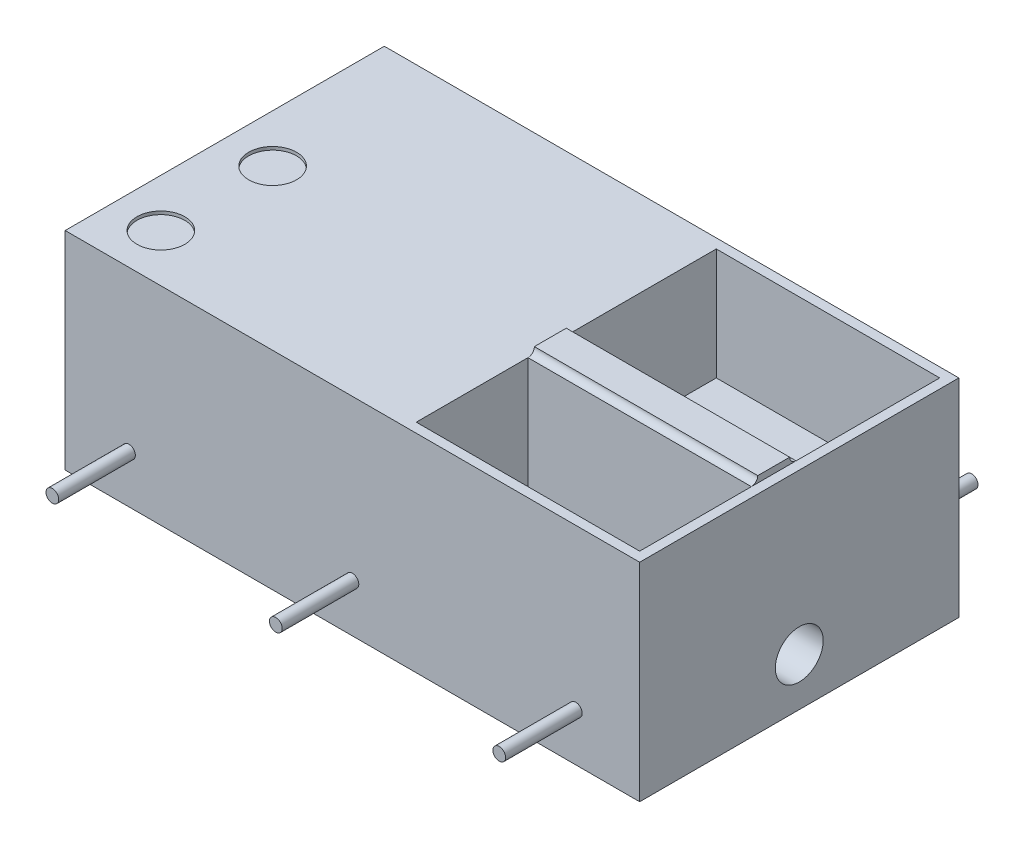
ISO-10303-21;
HEADER;
FILE_DESCRIPTION(('STEP AP214'),'2;1');
FILE_NAME('part.step','',(''),(''),'','','');
FILE_SCHEMA(('AUTOMOTIVE_DESIGN { 1 0 10303 214 1 1 1 1 }'));
ENDSEC;
DATA;
#1=APPLICATION_CONTEXT('core data for automotive mechanical design processes');
#2=APPLICATION_PROTOCOL_DEFINITION('international standard','automotive_design',2000,#1);
#3=PRODUCT_CONTEXT('',#1,'mechanical');
#4=PRODUCT('Part','Part','',(#3));
#5=PRODUCT_RELATED_PRODUCT_CATEGORY('part','',(#4));
#6=PRODUCT_DEFINITION_FORMATION('','',#4);
#7=PRODUCT_DEFINITION_CONTEXT('part definition',#1,'design');
#8=PRODUCT_DEFINITION('design','',#6,#7);
#9=PRODUCT_DEFINITION_SHAPE('','',#8);
#10=(LENGTH_UNIT() NAMED_UNIT(*) SI_UNIT(.MILLI.,.METRE.));
#11=(NAMED_UNIT(*) PLANE_ANGLE_UNIT() SI_UNIT($,.RADIAN.));
#12=(NAMED_UNIT(*) SI_UNIT($,.STERADIAN.) SOLID_ANGLE_UNIT());
#13=UNCERTAINTY_MEASURE_WITH_UNIT(LENGTH_MEASURE(1.E-05),#10,'distance_accuracy_value','');
#14=(GEOMETRIC_REPRESENTATION_CONTEXT(3) GLOBAL_UNCERTAINTY_ASSIGNED_CONTEXT((#13)) GLOBAL_UNIT_ASSIGNED_CONTEXT((#10,
#11,#12)) REPRESENTATION_CONTEXT('',''));
#15=CARTESIAN_POINT('',(0.,0.,0.));
#16=DIRECTION('',(0.,0.,1.));
#17=DIRECTION('',(1.,0.,0.));
#18=AXIS2_PLACEMENT_3D('',#15,#16,#17);
#19=CARTESIAN_POINT('',(900.,-650.,-500.));
#20=DIRECTION('',(1.,0.,0.));
#21=DIRECTION('',(0.,0.,-1.));
#22=AXIS2_PLACEMENT_3D('',#19,#20,#21);
#23=PLANE('',#22);
#24=CARTESIAN_POINT('',(900.,-500.,0.));
#25=DIRECTION('',(1.,0.,0.));
#26=DIRECTION('',(0.,0.,-1.));
#27=AXIS2_PLACEMENT_3D('',#24,#25,#26);
#28=CIRCLE('',#27,75.);
#29=CARTESIAN_POINT('',(900.,-500.,-75.));
#30=VERTEX_POINT('',#29);
#31=EDGE_CURVE('E397',#30,#30,#28,.T.);
#32=ORIENTED_EDGE('',*,*,#31,.F.);
#33=EDGE_LOOP('',(#32));
#34=FACE_BOUND('',#33,.T.);
#35=DIRECTION('',(0.,0.,-1.));
#36=VECTOR('',#35,1.);
#37=CARTESIAN_POINT('',(900.,0.,-500.));
#38=LINE('',#37,#36);
#39=CARTESIAN_POINT('',(900.,0.,500.));
#40=VERTEX_POINT('',#39);
#41=CARTESIAN_POINT('',(900.,0.,-500.));
#42=VERTEX_POINT('',#41);
#43=EDGE_CURVE('E283',#40,#42,#38,.T.);
#44=ORIENTED_EDGE('',*,*,#43,.F.);
#45=DIRECTION('',(0.,1.,0.));
#46=VECTOR('',#45,1.);
#47=CARTESIAN_POINT('',(900.,-650.,500.));
#48=LINE('',#47,#46);
#49=CARTESIAN_POINT('',(900.,-650.,500.));
#50=VERTEX_POINT('',#49);
#51=EDGE_CURVE('E321',#50,#40,#48,.T.);
#52=ORIENTED_EDGE('',*,*,#51,.F.);
#53=DIRECTION('',(0.,0.,-1.));
#54=VECTOR('',#53,1.);
#55=CARTESIAN_POINT('',(900.,-650.,-500.));
#56=LINE('',#55,#54);
#57=CARTESIAN_POINT('',(900.,-650.,-500.));
#58=VERTEX_POINT('',#57);
#59=EDGE_CURVE('E289',#50,#58,#56,.T.);
#60=ORIENTED_EDGE('',*,*,#59,.T.);
#61=DIRECTION('',(0.,1.,0.));
#62=VECTOR('',#61,1.);
#63=CARTESIAN_POINT('',(900.,-650.,-500.));
#64=LINE('',#63,#62);
#65=EDGE_CURVE('E306',#58,#42,#64,.T.);
#66=ORIENTED_EDGE('',*,*,#65,.T.);
#67=EDGE_LOOP('',(#44,#52,#60,#66));
#68=FACE_BOUND('',#67,.T.);
#69=ADVANCED_FACE('F38',(#34,#68),#23,.T.);
#70=CARTESIAN_POINT('',(-900.,-650.,500.));
#71=DIRECTION('',(0.,0.,1.));
#72=DIRECTION('',(1.,0.,0.));
#73=AXIS2_PLACEMENT_3D('',#70,#71,#72);
#74=PLANE('',#73);
#75=CARTESIAN_POINT('',(700.,-500.,500.));
#76=DIRECTION('',(0.,0.,1.));
#77=DIRECTION('',(1.,0.,0.));
#78=AXIS2_PLACEMENT_3D('',#75,#76,#77);
#79=CIRCLE('',#78,20.);
#80=CARTESIAN_POINT('',(720.,-500.,500.));
#81=VERTEX_POINT('',#80);
#82=EDGE_CURVE('E258',#81,#81,#79,.T.);
#83=ORIENTED_EDGE('',*,*,#82,.F.);
#84=EDGE_LOOP('',(#83));
#85=FACE_BOUND('',#84,.T.);
#86=CARTESIAN_POINT('',(-700.,-500.,500.));
#87=DIRECTION('',(0.,0.,1.));
#88=DIRECTION('',(1.,0.,0.));
#89=AXIS2_PLACEMENT_3D('',#86,#87,#88);
#90=CIRCLE('',#89,20.);
#91=CARTESIAN_POINT('',(-680.,-500.,500.));
#92=VERTEX_POINT('',#91);
#93=EDGE_CURVE('E271',#92,#92,#90,.T.);
#94=ORIENTED_EDGE('',*,*,#93,.F.);
#95=EDGE_LOOP('',(#94));
#96=FACE_BOUND('',#95,.T.);
#97=CARTESIAN_POINT('',(-1.11022302462516E-13,-500.,500.));
#98=DIRECTION('',(0.,0.,1.));
#99=DIRECTION('',(1.,0.,0.));
#100=AXIS2_PLACEMENT_3D('',#97,#98,#99);
#101=CIRCLE('',#100,20.);
#102=CARTESIAN_POINT('',(19.9999999999999,-500.,500.));
#103=VERTEX_POINT('',#102);
#104=EDGE_CURVE('E284',#103,#103,#101,.T.);
#105=ORIENTED_EDGE('',*,*,#104,.F.);
#106=EDGE_LOOP('',(#105));
#107=FACE_BOUND('',#106,.T.);
#108=DIRECTION('',(1.,0.,0.));
#109=VECTOR('',#108,1.);
#110=CARTESIAN_POINT('',(-900.,0.,500.));
#111=LINE('',#110,#109);
#112=CARTESIAN_POINT('',(-900.,0.,500.));
#113=VERTEX_POINT('',#112);
#114=EDGE_CURVE('E294',#113,#40,#111,.T.);
#115=ORIENTED_EDGE('',*,*,#114,.F.);
#116=DIRECTION('',(0.,1.,0.));
#117=VECTOR('',#116,1.);
#118=CARTESIAN_POINT('',(-900.,-650.,500.));
#119=LINE('',#118,#117);
#120=CARTESIAN_POINT('',(-900.,-650.,500.));
#121=VERTEX_POINT('',#120);
#122=EDGE_CURVE('E324',#121,#113,#119,.T.);
#123=ORIENTED_EDGE('',*,*,#122,.F.);
#124=DIRECTION('',(1.,0.,0.));
#125=VECTOR('',#124,1.);
#126=CARTESIAN_POINT('',(-900.,-650.,500.));
#127=LINE('',#126,#125);
#128=EDGE_CURVE('E302',#121,#50,#127,.T.);
#129=ORIENTED_EDGE('',*,*,#128,.T.);
#130=ORIENTED_EDGE('',*,*,#51,.T.);
#131=EDGE_LOOP('',(#115,#123,#129,#130));
#132=FACE_BOUND('',#131,.T.);
#133=ADVANCED_FACE('F386',(#85,#96,#107,#132),#74,.T.);
#134=CARTESIAN_POINT('',(-900.,-650.,-500.));
#135=DIRECTION('',(-1.,0.,0.));
#136=DIRECTION('',(0.,0.,1.));
#137=AXIS2_PLACEMENT_3D('',#134,#135,#136);
#138=PLANE('',#137);
#139=CARTESIAN_POINT('',(-900.,-500.,4.2188474935756E-13));
#140=DIRECTION('',(-1.,0.,0.));
#141=DIRECTION('',(0.,0.,1.));
#142=AXIS2_PLACEMENT_3D('',#139,#140,#141);
#143=CIRCLE('',#142,75.);
#144=CARTESIAN_POINT('',(-900.,-500.,75.0000000000004));
#145=VERTEX_POINT('',#144);
#146=EDGE_CURVE('E349',#145,#145,#143,.F.);
#147=ORIENTED_EDGE('',*,*,#146,.T.);
#148=EDGE_LOOP('',(#147));
#149=FACE_BOUND('',#148,.T.);
#150=DIRECTION('',(0.,0.,1.));
#151=VECTOR('',#150,1.);
#152=CARTESIAN_POINT('',(-900.,0.,-500.));
#153=LINE('',#152,#151);
#154=CARTESIAN_POINT('',(-900.,0.,-500.));
#155=VERTEX_POINT('',#154);
#156=EDGE_CURVE('E314',#155,#113,#153,.T.);
#157=ORIENTED_EDGE('',*,*,#156,.F.);
#158=DIRECTION('',(0.,1.,0.));
#159=VECTOR('',#158,1.);
#160=CARTESIAN_POINT('',(-900.,-650.,-500.));
#161=LINE('',#160,#159);
#162=CARTESIAN_POINT('',(-900.,-650.,-500.));
#163=VERTEX_POINT('',#162);
#164=EDGE_CURVE('E327',#163,#155,#161,.T.);
#165=ORIENTED_EDGE('',*,*,#164,.F.);
#166=DIRECTION('',(0.,0.,1.));
#167=VECTOR('',#166,1.);
#168=CARTESIAN_POINT('',(-900.,-650.,-500.));
#169=LINE('',#168,#167);
#170=EDGE_CURVE('E298',#163,#121,#169,.T.);
#171=ORIENTED_EDGE('',*,*,#170,.T.);
#172=ORIENTED_EDGE('',*,*,#122,.T.);
#173=EDGE_LOOP('',(#157,#165,#171,#172));
#174=FACE_BOUND('',#173,.T.);
#175=ADVANCED_FACE('F391',(#149,#174),#138,.T.);
#176=CARTESIAN_POINT('',(-900.,-650.,-500.));
#177=DIRECTION('',(0.,0.,-1.));
#178=DIRECTION('',(-1.,0.,0.));
#179=AXIS2_PLACEMENT_3D('',#176,#177,#178);
#180=PLANE('',#179);
#181=CARTESIAN_POINT('',(700.,-500.,-500.));
#182=DIRECTION('',(0.,0.,-1.));
#183=DIRECTION('',(-1.,0.,0.));
#184=AXIS2_PLACEMENT_3D('',#181,#182,#183);
#185=CIRCLE('',#184,20.);
#186=CARTESIAN_POINT('',(680.,-500.,-500.));
#187=VERTEX_POINT('',#186);
#188=EDGE_CURVE('E262',#187,#187,#185,.T.);
#189=ORIENTED_EDGE('',*,*,#188,.F.);
#190=EDGE_LOOP('',(#189));
#191=FACE_BOUND('',#190,.T.);
#192=CARTESIAN_POINT('',(-700.,-500.,-500.));
#193=DIRECTION('',(0.,0.,-1.));
#194=DIRECTION('',(-1.,0.,0.));
#195=AXIS2_PLACEMENT_3D('',#192,#193,#194);
#196=CIRCLE('',#195,20.);
#197=CARTESIAN_POINT('',(-720.,-500.,-500.));
#198=VERTEX_POINT('',#197);
#199=EDGE_CURVE('E275',#198,#198,#196,.T.);
#200=ORIENTED_EDGE('',*,*,#199,.F.);
#201=EDGE_LOOP('',(#200));
#202=FACE_BOUND('',#201,.T.);
#203=CARTESIAN_POINT('',(-1.11022302462516E-13,-500.,-500.));
#204=DIRECTION('',(0.,0.,-1.));
#205=DIRECTION('',(-1.,0.,0.));
#206=AXIS2_PLACEMENT_3D('',#203,#204,#205);
#207=CIRCLE('',#206,20.);
#208=CARTESIAN_POINT('',(-20.0000000000001,-500.,-500.));
#209=VERTEX_POINT('',#208);
#210=EDGE_CURVE('E288',#209,#209,#207,.T.);
#211=ORIENTED_EDGE('',*,*,#210,.F.);
#212=EDGE_LOOP('',(#211));
#213=FACE_BOUND('',#212,.T.);
#214=DIRECTION('',(-1.,0.,0.));
#215=VECTOR('',#214,1.);
#216=CARTESIAN_POINT('',(-900.,0.,-500.));
#217=LINE('',#216,#215);
#218=EDGE_CURVE('E310',#42,#155,#217,.T.);
#219=ORIENTED_EDGE('',*,*,#218,.F.);
#220=ORIENTED_EDGE('',*,*,#65,.F.);
#221=DIRECTION('',(-1.,0.,0.));
#222=VECTOR('',#221,1.);
#223=CARTESIAN_POINT('',(-900.,-650.,-500.));
#224=LINE('',#223,#222);
#225=EDGE_CURVE('E293',#58,#163,#224,.T.);
#226=ORIENTED_EDGE('',*,*,#225,.T.);
#227=ORIENTED_EDGE('',*,*,#164,.T.);
#228=EDGE_LOOP('',(#219,#220,#226,#227));
#229=FACE_BOUND('',#228,.T.);
#230=ADVANCED_FACE('F410',(#191,#202,#213,#229),#180,.T.);
#231=CARTESIAN_POINT('',(0.,-650.,0.));
#232=DIRECTION('',(0.,1.,0.));
#233=DIRECTION('',(0.,0.,1.));
#234=AXIS2_PLACEMENT_3D('',#231,#232,#233);
#235=PLANE('',#234);
#236=ORIENTED_EDGE('',*,*,#59,.F.);
#237=ORIENTED_EDGE('',*,*,#128,.F.);
#238=ORIENTED_EDGE('',*,*,#170,.F.);
#239=ORIENTED_EDGE('',*,*,#225,.F.);
#240=EDGE_LOOP('',(#236,#237,#238,#239));
#241=FACE_BOUND('',#240,.T.);
#242=ADVANCED_FACE('F407',(#241),#235,.F.);
#243=CARTESIAN_POINT('',(0.,0.,0.));
#244=DIRECTION('',(0.,1.,0.));
#245=DIRECTION('',(0.,0.,1.));
#246=AXIS2_PLACEMENT_3D('',#243,#244,#245);
#247=PLANE('',#246);
#248=CARTESIAN_POINT('',(-750.,0.,0.));
#249=DIRECTION('',(0.,1.,0.));
#250=DIRECTION('',(0.,0.,1.));
#251=AXIS2_PLACEMENT_3D('',#248,#249,#250);
#252=CIRCLE('',#251,75.);
#253=CARTESIAN_POINT('',(-750.,0.,75.));
#254=VERTEX_POINT('',#253);
#255=EDGE_CURVE('E642',#254,#254,#252,.T.);
#256=ORIENTED_EDGE('',*,*,#255,.F.);
#257=EDGE_LOOP('',(#256));
#258=FACE_BOUND('',#257,.T.);
#259=CARTESIAN_POINT('',(-750.,0.,350.));
#260=DIRECTION('',(0.,1.,0.));
#261=DIRECTION('',(0.,0.,1.));
#262=AXIS2_PLACEMENT_3D('',#259,#260,#261);
#263=CIRCLE('',#262,75.);
#264=CARTESIAN_POINT('',(-750.,0.,425.));
#265=VERTEX_POINT('',#264);
#266=EDGE_CURVE('E641',#265,#265,#263,.T.);
#267=ORIENTED_EDGE('',*,*,#266,.F.);
#268=EDGE_LOOP('',(#267));
#269=FACE_BOUND('',#268,.T.);
#270=DIRECTION('',(0.,0.,1.));
#271=VECTOR('',#270,1.);
#272=CARTESIAN_POINT('',(170.,0.,-19.9999999999999));
#273=LINE('',#272,#271);
#274=CARTESIAN_POINT('',(170.,1.28369537222284E-13,-19.9999999999999));
#275=VERTEX_POINT('',#274);
#276=CARTESIAN_POINT('',(170.,0.,120.));
#277=VERTEX_POINT('',#276);
#278=EDGE_CURVE('E153',#275,#277,#273,.T.);
#279=ORIENTED_EDGE('',*,*,#278,.F.);
#280=DIRECTION('',(0.,0.,1.));
#281=VECTOR('',#280,1.);
#282=CARTESIAN_POINT('',(170.,0.,-470.));
#283=LINE('',#282,#281);
#284=CARTESIAN_POINT('',(170.,0.,-470.));
#285=VERTEX_POINT('',#284);
#286=EDGE_CURVE('E165',#285,#275,#283,.T.);
#287=ORIENTED_EDGE('',*,*,#286,.F.);
#288=DIRECTION('',(-1.,0.,0.));
#289=VECTOR('',#288,1.);
#290=CARTESIAN_POINT('',(870.,0.,-470.));
#291=LINE('',#290,#289);
#292=CARTESIAN_POINT('',(870.,0.,-470.));
#293=VERTEX_POINT('',#292);
#294=EDGE_CURVE('E187',#293,#285,#291,.T.);
#295=ORIENTED_EDGE('',*,*,#294,.F.);
#296=DIRECTION('',(0.,0.,-1.));
#297=VECTOR('',#296,1.);
#298=CARTESIAN_POINT('',(870.,0.,-470.));
#299=LINE('',#298,#297);
#300=CARTESIAN_POINT('',(870.,1.28369537222284E-13,-19.9999999999999));
#301=VERTEX_POINT('',#300);
#302=EDGE_CURVE('E194',#301,#293,#299,.T.);
#303=ORIENTED_EDGE('',*,*,#302,.F.);
#304=DIRECTION('',(0.,0.,-1.));
#305=VECTOR('',#304,1.);
#306=CARTESIAN_POINT('',(870.,0.,-19.9999999999999));
#307=LINE('',#306,#305);
#308=CARTESIAN_POINT('',(870.,0.,120.));
#309=VERTEX_POINT('',#308);
#310=EDGE_CURVE('E169',#309,#301,#307,.T.);
#311=ORIENTED_EDGE('',*,*,#310,.F.);
#312=DIRECTION('',(0.,0.,-1.));
#313=VECTOR('',#312,1.);
#314=CARTESIAN_POINT('',(870.,0.,120.));
#315=LINE('',#314,#313);
#316=CARTESIAN_POINT('',(870.,0.,470.));
#317=VERTEX_POINT('',#316);
#318=EDGE_CURVE('E213',#317,#309,#315,.T.);
#319=ORIENTED_EDGE('',*,*,#318,.F.);
#320=DIRECTION('',(1.,0.,0.));
#321=VECTOR('',#320,1.);
#322=CARTESIAN_POINT('',(170.,0.,470.));
#323=LINE('',#322,#321);
#324=CARTESIAN_POINT('',(170.,0.,470.));
#325=VERTEX_POINT('',#324);
#326=EDGE_CURVE('E228',#325,#317,#323,.T.);
#327=ORIENTED_EDGE('',*,*,#326,.F.);
#328=DIRECTION('',(0.,0.,1.));
#329=VECTOR('',#328,1.);
#330=CARTESIAN_POINT('',(170.,0.,120.));
#331=LINE('',#330,#329);
#332=EDGE_CURVE('E167',#277,#325,#331,.T.);
#333=ORIENTED_EDGE('',*,*,#332,.F.);
#334=EDGE_LOOP('',(#279,#287,#295,#303,#311,#319,#327,#333));
#335=FACE_BOUND('',#334,.T.);
#336=ORIENTED_EDGE('',*,*,#43,.T.);
#337=ORIENTED_EDGE('',*,*,#218,.T.);
#338=ORIENTED_EDGE('',*,*,#156,.T.);
#339=ORIENTED_EDGE('',*,*,#114,.T.);
#340=EDGE_LOOP('',(#336,#337,#338,#339));
#341=FACE_BOUND('',#340,.T.);
#342=ADVANCED_FACE('F161',(#258,#269,#335,#341),#247,.T.);
#343=CARTESIAN_POINT('',(-1.11022302462516E-13,-500.,-740.));
#344=DIRECTION('',(0.,0.,1.));
#345=DIRECTION('',(1.,0.,0.));
#346=AXIS2_PLACEMENT_3D('',#343,#344,#345);
#347=PLANE('',#346);
#348=CARTESIAN_POINT('',(-1.11022302462516E-13,-500.,-740.));
#349=DIRECTION('',(0.,0.,1.));
#350=DIRECTION('',(1.,0.,0.));
#351=AXIS2_PLACEMENT_3D('',#348,#349,#350);
#352=CIRCLE('',#351,20.);
#353=CARTESIAN_POINT('',(19.9999999999999,-500.,-740.));
#354=VERTEX_POINT('',#353);
#355=EDGE_CURVE('E279',#354,#354,#352,.T.);
#356=ORIENTED_EDGE('',*,*,#355,.F.);
#357=EDGE_LOOP('',(#356));
#358=FACE_BOUND('',#357,.T.);
#359=ADVANCED_FACE('F423',(#358),#347,.F.);
#360=CARTESIAN_POINT('',(-1.11022302462516E-13,-500.,-740.));
#361=DIRECTION('',(0.,0.,1.));
#362=DIRECTION('',(1.,0.,0.));
#363=AXIS2_PLACEMENT_3D('',#360,#361,#362);
#364=CYLINDRICAL_SURFACE('',#363,20.);
#365=ORIENTED_EDGE('',*,*,#210,.T.);
#366=EDGE_LOOP('',(#365));
#367=FACE_BOUND('',#366,.T.);
#368=ORIENTED_EDGE('',*,*,#355,.T.);
#369=EDGE_LOOP('',(#368));
#370=FACE_BOUND('',#369,.T.);
#371=ADVANCED_FACE('F427',(#367,#370),#364,.T.);
#372=ORIENTED_EDGE('',*,*,#104,.T.);
#373=EDGE_LOOP('',(#372));
#374=FACE_BOUND('',#373,.T.);
#375=CARTESIAN_POINT('',(-1.11022302462516E-13,-500.,740.));
#376=DIRECTION('',(0.,0.,1.));
#377=DIRECTION('',(1.,0.,0.));
#378=AXIS2_PLACEMENT_3D('',#375,#376,#377);
#379=CIRCLE('',#378,20.);
#380=CARTESIAN_POINT('',(19.9999999999999,-500.,740.));
#381=VERTEX_POINT('',#380);
#382=EDGE_CURVE('E270',#381,#381,#379,.T.);
#383=ORIENTED_EDGE('',*,*,#382,.F.);
#384=EDGE_LOOP('',(#383));
#385=FACE_BOUND('',#384,.T.);
#386=ADVANCED_FACE('F430',(#374,#385),#364,.T.);
#387=CARTESIAN_POINT('',(-1.11022302462516E-13,-500.,740.));
#388=DIRECTION('',(0.,0.,1.));
#389=DIRECTION('',(1.,0.,0.));
#390=AXIS2_PLACEMENT_3D('',#387,#388,#389);
#391=PLANE('',#390);
#392=ORIENTED_EDGE('',*,*,#382,.T.);
#393=EDGE_LOOP('',(#392));
#394=FACE_BOUND('',#393,.T.);
#395=ADVANCED_FACE('F435',(#394),#391,.T.);
#396=CARTESIAN_POINT('',(-700.,-500.,-740.));
#397=DIRECTION('',(0.,0.,1.));
#398=DIRECTION('',(1.,0.,0.));
#399=AXIS2_PLACEMENT_3D('',#396,#397,#398);
#400=PLANE('',#399);
#401=CARTESIAN_POINT('',(-700.,-500.,-740.));
#402=DIRECTION('',(0.,0.,1.));
#403=DIRECTION('',(1.,0.,0.));
#404=AXIS2_PLACEMENT_3D('',#401,#402,#403);
#405=CIRCLE('',#404,20.);
#406=CARTESIAN_POINT('',(-680.,-500.,-740.));
#407=VERTEX_POINT('',#406);
#408=EDGE_CURVE('E266',#407,#407,#405,.T.);
#409=ORIENTED_EDGE('',*,*,#408,.F.);
#410=EDGE_LOOP('',(#409));
#411=FACE_BOUND('',#410,.T.);
#412=ADVANCED_FACE('F438',(#411),#400,.F.);
#413=CARTESIAN_POINT('',(-700.,-500.,-740.));
#414=DIRECTION('',(0.,0.,1.));
#415=DIRECTION('',(1.,0.,0.));
#416=AXIS2_PLACEMENT_3D('',#413,#414,#415);
#417=CYLINDRICAL_SURFACE('',#416,20.);
#418=ORIENTED_EDGE('',*,*,#199,.T.);
#419=EDGE_LOOP('',(#418));
#420=FACE_BOUND('',#419,.T.);
#421=ORIENTED_EDGE('',*,*,#408,.T.);
#422=EDGE_LOOP('',(#421));
#423=FACE_BOUND('',#422,.T.);
#424=ADVANCED_FACE('F440',(#420,#423),#417,.T.);
#425=ORIENTED_EDGE('',*,*,#93,.T.);
#426=EDGE_LOOP('',(#425));
#427=FACE_BOUND('',#426,.T.);
#428=CARTESIAN_POINT('',(-700.,-500.,740.));
#429=DIRECTION('',(0.,0.,1.));
#430=DIRECTION('',(1.,0.,0.));
#431=AXIS2_PLACEMENT_3D('',#428,#429,#430);
#432=CIRCLE('',#431,20.);
#433=CARTESIAN_POINT('',(-680.,-500.,740.));
#434=VERTEX_POINT('',#433);
#435=EDGE_CURVE('E257',#434,#434,#432,.T.);
#436=ORIENTED_EDGE('',*,*,#435,.F.);
#437=EDGE_LOOP('',(#436));
#438=FACE_BOUND('',#437,.T.);
#439=ADVANCED_FACE('F443',(#427,#438),#417,.T.);
#440=CARTESIAN_POINT('',(-700.,-500.,740.));
#441=DIRECTION('',(0.,0.,1.));
#442=DIRECTION('',(1.,0.,0.));
#443=AXIS2_PLACEMENT_3D('',#440,#441,#442);
#444=PLANE('',#443);
#445=ORIENTED_EDGE('',*,*,#435,.T.);
#446=EDGE_LOOP('',(#445));
#447=FACE_BOUND('',#446,.T.);
#448=ADVANCED_FACE('F448',(#447),#444,.T.);
#449=CARTESIAN_POINT('',(700.,-500.,-740.));
#450=DIRECTION('',(0.,0.,-1.));
#451=DIRECTION('',(-1.,0.,0.));
#452=AXIS2_PLACEMENT_3D('',#449,#450,#451);
#453=PLANE('',#452);
#454=CARTESIAN_POINT('',(700.,-500.,-740.));
#455=DIRECTION('',(0.,0.,1.));
#456=DIRECTION('',(-1.,0.,0.));
#457=AXIS2_PLACEMENT_3D('',#454,#455,#456);
#458=CIRCLE('',#457,20.);
#459=CARTESIAN_POINT('',(680.,-500.,-740.));
#460=VERTEX_POINT('',#459);
#461=EDGE_CURVE('E253',#460,#460,#458,.T.);
#462=ORIENTED_EDGE('',*,*,#461,.F.);
#463=EDGE_LOOP('',(#462));
#464=FACE_BOUND('',#463,.T.);
#465=ADVANCED_FACE('F451',(#464),#453,.T.);
#466=CARTESIAN_POINT('',(700.,-500.,-740.));
#467=DIRECTION('',(0.,0.,1.));
#468=DIRECTION('',(1.,0.,0.));
#469=AXIS2_PLACEMENT_3D('',#466,#467,#468);
#470=CYLINDRICAL_SURFACE('',#469,20.);
#471=ORIENTED_EDGE('',*,*,#188,.T.);
#472=EDGE_LOOP('',(#471));
#473=FACE_BOUND('',#472,.T.);
#474=ORIENTED_EDGE('',*,*,#461,.T.);
#475=EDGE_LOOP('',(#474));
#476=FACE_BOUND('',#475,.T.);
#477=ADVANCED_FACE('F453',(#473,#476),#470,.T.);
#478=ORIENTED_EDGE('',*,*,#82,.T.);
#479=EDGE_LOOP('',(#478));
#480=FACE_BOUND('',#479,.T.);
#481=CARTESIAN_POINT('',(700.,-500.,740.));
#482=DIRECTION('',(0.,0.,1.));
#483=DIRECTION('',(-1.,0.,0.));
#484=AXIS2_PLACEMENT_3D('',#481,#482,#483);
#485=CIRCLE('',#484,20.);
#486=CARTESIAN_POINT('',(680.,-500.,740.));
#487=VERTEX_POINT('',#486);
#488=EDGE_CURVE('E200',#487,#487,#485,.T.);
#489=ORIENTED_EDGE('',*,*,#488,.F.);
#490=EDGE_LOOP('',(#489));
#491=FACE_BOUND('',#490,.T.);
#492=ADVANCED_FACE('F456',(#480,#491),#470,.T.);
#493=CARTESIAN_POINT('',(700.,-500.,740.));
#494=DIRECTION('',(0.,0.,-1.));
#495=DIRECTION('',(-1.,0.,0.));
#496=AXIS2_PLACEMENT_3D('',#493,#494,#495);
#497=PLANE('',#496);
#498=ORIENTED_EDGE('',*,*,#488,.T.);
#499=EDGE_LOOP('',(#498));
#500=FACE_BOUND('',#499,.T.);
#501=ADVANCED_FACE('F461',(#500),#497,.F.);
#502=CARTESIAN_POINT('',(170.,-350.,120.));
#503=DIRECTION('',(-1.,0.,0.));
#504=DIRECTION('',(0.,0.,1.));
#505=AXIS2_PLACEMENT_3D('',#502,#503,#504);
#506=PLANE('',#505);
#507=ORIENTED_EDGE('',*,*,#332,.T.);
#508=DIRECTION('',(0.,1.,0.));
#509=VECTOR('',#508,1.);
#510=CARTESIAN_POINT('',(170.,-350.,470.));
#511=LINE('',#510,#509);
#512=CARTESIAN_POINT('',(170.,-350.,470.));
#513=VERTEX_POINT('',#512);
#514=EDGE_CURVE('E225',#513,#325,#511,.T.);
#515=ORIENTED_EDGE('',*,*,#514,.F.);
#516=DIRECTION('',(0.,0.,1.));
#517=VECTOR('',#516,1.);
#518=CARTESIAN_POINT('',(170.,-350.,120.));
#519=LINE('',#518,#517);
#520=CARTESIAN_POINT('',(170.,-350.,120.));
#521=VERTEX_POINT('',#520);
#522=EDGE_CURVE('E208',#521,#513,#519,.T.);
#523=ORIENTED_EDGE('',*,*,#522,.F.);
#524=DIRECTION('',(0.,1.,0.));
#525=VECTOR('',#524,1.);
#526=CARTESIAN_POINT('',(170.,-350.,120.));
#527=LINE('',#526,#525);
#528=EDGE_CURVE('E236',#521,#277,#527,.T.);
#529=ORIENTED_EDGE('',*,*,#528,.T.);
#530=EDGE_LOOP('',(#507,#515,#523,#529));
#531=FACE_BOUND('',#530,.T.);
#532=ADVANCED_FACE('F464',(#531),#506,.F.);
#533=CARTESIAN_POINT('',(170.,-350.,120.));
#534=DIRECTION('',(0.,0.,-1.));
#535=DIRECTION('',(-1.,0.,0.));
#536=AXIS2_PLACEMENT_3D('',#533,#534,#535);
#537=PLANE('',#536);
#538=DIRECTION('',(0.,1.,0.));
#539=VECTOR('',#538,1.);
#540=CARTESIAN_POINT('',(870.,-350.,120.));
#541=LINE('',#540,#539);
#542=CARTESIAN_POINT('',(870.,-350.,120.));
#543=VERTEX_POINT('',#542);
#544=EDGE_CURVE('E240',#543,#309,#541,.T.);
#545=ORIENTED_EDGE('',*,*,#544,.T.);
#546=DIRECTION('',(1.,0.,0.));
#547=VECTOR('',#546,1.);
#548=CARTESIAN_POINT('',(113.431457505076,0.,120.));
#549=LINE('',#548,#547);
#550=EDGE_CURVE('E144',#309,#277,#549,.F.);
#551=ORIENTED_EDGE('',*,*,#550,.T.);
#552=ORIENTED_EDGE('',*,*,#528,.F.);
#553=DIRECTION('',(-1.,0.,0.));
#554=VECTOR('',#553,1.);
#555=CARTESIAN_POINT('',(170.,-350.,120.));
#556=LINE('',#555,#554);
#557=EDGE_CURVE('E221',#543,#521,#556,.T.);
#558=ORIENTED_EDGE('',*,*,#557,.F.);
#559=EDGE_LOOP('',(#545,#551,#552,#558));
#560=FACE_BOUND('',#559,.T.);
#561=ADVANCED_FACE('F468',(#560),#537,.F.);
#562=CARTESIAN_POINT('',(870.,-350.,120.));
#563=DIRECTION('',(1.,0.,0.));
#564=DIRECTION('',(0.,0.,-1.));
#565=AXIS2_PLACEMENT_3D('',#562,#563,#564);
#566=PLANE('',#565);
#567=ORIENTED_EDGE('',*,*,#318,.T.);
#568=ORIENTED_EDGE('',*,*,#544,.F.);
#569=DIRECTION('',(0.,0.,-1.));
#570=VECTOR('',#569,1.);
#571=CARTESIAN_POINT('',(870.,-350.,120.));
#572=LINE('',#571,#570);
#573=CARTESIAN_POINT('',(870.,-350.,470.));
#574=VERTEX_POINT('',#573);
#575=EDGE_CURVE('E217',#574,#543,#572,.T.);
#576=ORIENTED_EDGE('',*,*,#575,.F.);
#577=DIRECTION('',(0.,1.,0.));
#578=VECTOR('',#577,1.);
#579=CARTESIAN_POINT('',(870.,-350.,470.));
#580=LINE('',#579,#578);
#581=EDGE_CURVE('E244',#574,#317,#580,.T.);
#582=ORIENTED_EDGE('',*,*,#581,.T.);
#583=EDGE_LOOP('',(#567,#568,#576,#582));
#584=FACE_BOUND('',#583,.T.);
#585=ADVANCED_FACE('F474',(#584),#566,.F.);
#586=CARTESIAN_POINT('',(170.,-350.,470.));
#587=DIRECTION('',(0.,0.,1.));
#588=DIRECTION('',(1.,0.,0.));
#589=AXIS2_PLACEMENT_3D('',#586,#587,#588);
#590=PLANE('',#589);
#591=ORIENTED_EDGE('',*,*,#326,.T.);
#592=ORIENTED_EDGE('',*,*,#581,.F.);
#593=DIRECTION('',(1.,0.,0.));
#594=VECTOR('',#593,1.);
#595=CARTESIAN_POINT('',(170.,-350.,470.));
#596=LINE('',#595,#594);
#597=EDGE_CURVE('E212',#513,#574,#596,.T.);
#598=ORIENTED_EDGE('',*,*,#597,.F.);
#599=ORIENTED_EDGE('',*,*,#514,.T.);
#600=EDGE_LOOP('',(#591,#592,#598,#599));
#601=FACE_BOUND('',#600,.T.);
#602=ADVANCED_FACE('F470',(#601),#590,.F.);
#603=CARTESIAN_POINT('',(0.,-350.,0.));
#604=DIRECTION('',(0.,1.,0.));
#605=DIRECTION('',(0.,0.,1.));
#606=AXIS2_PLACEMENT_3D('',#603,#604,#605);
#607=PLANE('',#606);
#608=ORIENTED_EDGE('',*,*,#522,.T.);
#609=ORIENTED_EDGE('',*,*,#597,.T.);
#610=ORIENTED_EDGE('',*,*,#575,.T.);
#611=ORIENTED_EDGE('',*,*,#557,.T.);
#612=EDGE_LOOP('',(#608,#609,#610,#611));
#613=FACE_BOUND('',#612,.T.);
#614=ADVANCED_FACE('F473',(#613),#607,.T.);
#615=CARTESIAN_POINT('',(870.,-350.,-470.));
#616=DIRECTION('',(1.,0.,0.));
#617=DIRECTION('',(0.,0.,-1.));
#618=AXIS2_PLACEMENT_3D('',#615,#616,#617);
#619=PLANE('',#618);
#620=ORIENTED_EDGE('',*,*,#302,.T.);
#621=DIRECTION('',(0.,1.,0.));
#622=VECTOR('',#621,1.);
#623=CARTESIAN_POINT('',(870.,-350.,-470.));
#624=LINE('',#623,#622);
#625=CARTESIAN_POINT('',(870.,-350.,-470.));
#626=VERTEX_POINT('',#625);
#627=EDGE_CURVE('E204',#626,#293,#624,.T.);
#628=ORIENTED_EDGE('',*,*,#627,.F.);
#629=DIRECTION('',(0.,0.,-1.));
#630=VECTOR('',#629,1.);
#631=CARTESIAN_POINT('',(870.,-350.,-470.));
#632=LINE('',#631,#630);
#633=CARTESIAN_POINT('',(870.,-350.,-20.));
#634=VERTEX_POINT('',#633);
#635=EDGE_CURVE('E186',#634,#626,#632,.T.);
#636=ORIENTED_EDGE('',*,*,#635,.F.);
#637=DIRECTION('',(0.,1.,0.));
#638=VECTOR('',#637,1.);
#639=CARTESIAN_POINT('',(870.,-350.,-20.));
#640=LINE('',#639,#638);
#641=EDGE_CURVE('E180',#634,#301,#640,.T.);
#642=ORIENTED_EDGE('',*,*,#641,.T.);
#643=EDGE_LOOP('',(#620,#628,#636,#642));
#644=FACE_BOUND('',#643,.T.);
#645=ADVANCED_FACE('F369',(#644),#619,.F.);
#646=CARTESIAN_POINT('',(870.,-350.,-20.));
#647=DIRECTION('',(0.,0.,1.));
#648=DIRECTION('',(1.,0.,0.));
#649=AXIS2_PLACEMENT_3D('',#646,#647,#648);
#650=PLANE('',#649);
#651=DIRECTION('',(0.,1.,0.));
#652=VECTOR('',#651,1.);
#653=CARTESIAN_POINT('',(170.,-350.,-19.9999999999999));
#654=LINE('',#653,#652);
#655=CARTESIAN_POINT('',(170.,-350.,-19.9999999999999));
#656=VERTEX_POINT('',#655);
#657=EDGE_CURVE('E172',#656,#275,#654,.T.);
#658=ORIENTED_EDGE('',*,*,#657,.T.);
#659=DIRECTION('',(1.,0.,0.));
#660=VECTOR('',#659,1.);
#661=CARTESIAN_POINT('',(113.431457505076,1.31838984174237E-13,-19.9999999999999));
#662=LINE('',#661,#660);
#663=EDGE_CURVE('E136',#275,#301,#662,.T.);
#664=ORIENTED_EDGE('',*,*,#663,.T.);
#665=ORIENTED_EDGE('',*,*,#641,.F.);
#666=DIRECTION('',(1.,0.,0.));
#667=VECTOR('',#666,1.);
#668=CARTESIAN_POINT('',(870.,-350.,-20.));
#669=LINE('',#668,#667);
#670=EDGE_CURVE('E175',#656,#634,#669,.T.);
#671=ORIENTED_EDGE('',*,*,#670,.F.);
#672=EDGE_LOOP('',(#658,#664,#665,#671));
#673=FACE_BOUND('',#672,.T.);
#674=ADVANCED_FACE('F173',(#673),#650,.F.);
#675=CARTESIAN_POINT('',(170.,-350.,-470.));
#676=DIRECTION('',(-1.,0.,0.));
#677=DIRECTION('',(0.,0.,1.));
#678=AXIS2_PLACEMENT_3D('',#675,#676,#677);
#679=PLANE('',#678);
#680=ORIENTED_EDGE('',*,*,#286,.T.);
#681=ORIENTED_EDGE('',*,*,#657,.F.);
#682=DIRECTION('',(0.,0.,1.));
#683=VECTOR('',#682,1.);
#684=CARTESIAN_POINT('',(170.,-350.,-470.));
#685=LINE('',#684,#683);
#686=CARTESIAN_POINT('',(170.,-350.,-470.));
#687=VERTEX_POINT('',#686);
#688=EDGE_CURVE('E363',#687,#656,#685,.T.);
#689=ORIENTED_EDGE('',*,*,#688,.F.);
#690=DIRECTION('',(0.,1.,0.));
#691=VECTOR('',#690,1.);
#692=CARTESIAN_POINT('',(170.,-350.,-470.));
#693=LINE('',#692,#691);
#694=EDGE_CURVE('E181',#687,#285,#693,.T.);
#695=ORIENTED_EDGE('',*,*,#694,.T.);
#696=EDGE_LOOP('',(#680,#681,#689,#695));
#697=FACE_BOUND('',#696,.T.);
#698=ADVANCED_FACE('F183',(#697),#679,.F.);
#699=CARTESIAN_POINT('',(870.,-350.,-470.));
#700=DIRECTION('',(0.,0.,-1.));
#701=DIRECTION('',(-1.,0.,0.));
#702=AXIS2_PLACEMENT_3D('',#699,#700,#701);
#703=PLANE('',#702);
#704=ORIENTED_EDGE('',*,*,#294,.T.);
#705=ORIENTED_EDGE('',*,*,#694,.F.);
#706=DIRECTION('',(-1.,0.,0.));
#707=VECTOR('',#706,1.);
#708=CARTESIAN_POINT('',(870.,-350.,-470.));
#709=LINE('',#708,#707);
#710=EDGE_CURVE('E192',#626,#687,#709,.T.);
#711=ORIENTED_EDGE('',*,*,#710,.F.);
#712=ORIENTED_EDGE('',*,*,#627,.T.);
#713=EDGE_LOOP('',(#704,#705,#711,#712));
#714=FACE_BOUND('',#713,.T.);
#715=ADVANCED_FACE('F373',(#714),#703,.F.);
#716=CARTESIAN_POINT('',(0.,-350.,0.));
#717=DIRECTION('',(0.,-1.,0.));
#718=DIRECTION('',(0.,0.,-1.));
#719=AXIS2_PLACEMENT_3D('',#716,#717,#718);
#720=PLANE('',#719);
#721=ORIENTED_EDGE('',*,*,#635,.T.);
#722=ORIENTED_EDGE('',*,*,#710,.T.);
#723=ORIENTED_EDGE('',*,*,#688,.T.);
#724=ORIENTED_EDGE('',*,*,#670,.T.);
#725=EDGE_LOOP('',(#721,#722,#723,#724));
#726=FACE_BOUND('',#725,.T.);
#727=ADVANCED_FACE('F375',(#726),#720,.F.);
#728=CARTESIAN_POINT('',(170.,20.,-19.9999999999999));
#729=DIRECTION('',(1.,0.,0.));
#730=DIRECTION('',(0.,0.,-1.));
#731=AXIS2_PLACEMENT_3D('',#728,#729,#730);
#732=PLANE('',#731);
#733=ORIENTED_EDGE('',*,*,#278,.T.);
#734=CARTESIAN_POINT('',(170.,20.,120.));
#735=DIRECTION('',(1.,0.,0.));
#736=DIRECTION('',(0.,0.,-1.));
#737=AXIS2_PLACEMENT_3D('',#734,#735,#736);
#738=CIRCLE('',#737,20.);
#739=CARTESIAN_POINT('',(170.,20.,100.));
#740=VERTEX_POINT('',#739);
#741=EDGE_CURVE('E145',#740,#277,#738,.F.);
#742=ORIENTED_EDGE('',*,*,#741,.F.);
#743=DIRECTION('',(0.,0.,1.));
#744=VECTOR('',#743,1.);
#745=CARTESIAN_POINT('',(170.,20.,-19.9999999999999));
#746=LINE('',#745,#744);
#747=CARTESIAN_POINT('',(170.,20.,0.));
#748=VERTEX_POINT('',#747);
#749=EDGE_CURVE('E155',#748,#740,#746,.T.);
#750=ORIENTED_EDGE('',*,*,#749,.F.);
#751=CARTESIAN_POINT('',(170.,20.,-19.9999999999999));
#752=DIRECTION('',(1.,0.,0.));
#753=DIRECTION('',(0.,0.,-1.));
#754=AXIS2_PLACEMENT_3D('',#751,#752,#753);
#755=CIRCLE('',#754,19.9999999999999);
#756=EDGE_CURVE('E60',#275,#748,#755,.F.);
#757=ORIENTED_EDGE('',*,*,#756,.F.);
#758=EDGE_LOOP('',(#733,#742,#750,#757));
#759=FACE_BOUND('',#758,.T.);
#760=ADVANCED_FACE('F151',(#759),#732,.F.);
#761=CARTESIAN_POINT('',(870.,20.,-19.9999999999999));
#762=DIRECTION('',(-1.,0.,0.));
#763=DIRECTION('',(0.,0.,1.));
#764=AXIS2_PLACEMENT_3D('',#761,#762,#763);
#765=PLANE('',#764);
#766=DIRECTION('',(0.,0.,-1.));
#767=VECTOR('',#766,1.);
#768=CARTESIAN_POINT('',(870.,20.,-19.9999999999999));
#769=LINE('',#768,#767);
#770=CARTESIAN_POINT('',(870.,20.,100.));
#771=VERTEX_POINT('',#770);
#772=CARTESIAN_POINT('',(870.,20.,0.));
#773=VERTEX_POINT('',#772);
#774=EDGE_CURVE('E229',#771,#773,#769,.T.);
#775=ORIENTED_EDGE('',*,*,#774,.F.);
#776=CARTESIAN_POINT('',(870.,20.,120.));
#777=DIRECTION('',(1.,0.,0.));
#778=DIRECTION('',(0.,0.,-1.));
#779=AXIS2_PLACEMENT_3D('',#776,#777,#778);
#780=CIRCLE('',#779,20.);
#781=EDGE_CURVE('E52',#309,#771,#780,.T.);
#782=ORIENTED_EDGE('',*,*,#781,.F.);
#783=ORIENTED_EDGE('',*,*,#310,.T.);
#784=CARTESIAN_POINT('',(870.,20.,-19.9999999999999));
#785=DIRECTION('',(1.,0.,0.));
#786=DIRECTION('',(0.,0.,-1.));
#787=AXIS2_PLACEMENT_3D('',#784,#785,#786);
#788=CIRCLE('',#787,19.9999999999999);
#789=EDGE_CURVE('E139',#773,#301,#788,.T.);
#790=ORIENTED_EDGE('',*,*,#789,.F.);
#791=EDGE_LOOP('',(#775,#782,#783,#790));
#792=FACE_BOUND('',#791,.T.);
#793=ADVANCED_FACE('F346',(#792),#765,.F.);
#794=CARTESIAN_POINT('',(0.,20.,0.));
#795=DIRECTION('',(0.,1.,0.));
#796=DIRECTION('',(0.,0.,1.));
#797=AXIS2_PLACEMENT_3D('',#794,#795,#796);
#798=PLANE('',#797);
#799=DIRECTION('',(1.,0.,0.));
#800=VECTOR('',#799,1.);
#801=CARTESIAN_POINT('',(113.431457505076,20.,100.));
#802=LINE('',#801,#800);
#803=EDGE_CURVE('E11',#771,#740,#802,.F.);
#804=ORIENTED_EDGE('',*,*,#803,.F.);
#805=ORIENTED_EDGE('',*,*,#774,.T.);
#806=DIRECTION('',(1.,0.,0.));
#807=VECTOR('',#806,1.);
#808=CARTESIAN_POINT('',(113.431457505076,20.,0.));
#809=LINE('',#808,#807);
#810=EDGE_CURVE('E46',#748,#773,#809,.T.);
#811=ORIENTED_EDGE('',*,*,#810,.F.);
#812=ORIENTED_EDGE('',*,*,#749,.T.);
#813=EDGE_LOOP('',(#804,#805,#811,#812));
#814=FACE_BOUND('',#813,.T.);
#815=ADVANCED_FACE('F351',(#814),#798,.T.);
#816=CARTESIAN_POINT('',(113.431457505076,20.,-19.9999999999999));
#817=DIRECTION('',(1.,0.,0.));
#818=DIRECTION('',(0.,0.,-1.));
#819=AXIS2_PLACEMENT_3D('',#816,#817,#818);
#820=CYLINDRICAL_SURFACE('',#819,19.9999999999999);
#821=ORIENTED_EDGE('',*,*,#756,.T.);
#822=ORIENTED_EDGE('',*,*,#810,.T.);
#823=ORIENTED_EDGE('',*,*,#789,.T.);
#824=ORIENTED_EDGE('',*,*,#663,.F.);
#825=EDGE_LOOP('',(#821,#822,#823,#824));
#826=FACE_BOUND('',#825,.T.);
#827=ADVANCED_FACE('F137',(#826),#820,.F.);
#828=CARTESIAN_POINT('',(113.431457505076,20.,120.));
#829=DIRECTION('',(1.,0.,0.));
#830=DIRECTION('',(0.,0.,-1.));
#831=AXIS2_PLACEMENT_3D('',#828,#829,#830);
#832=CYLINDRICAL_SURFACE('',#831,20.);
#833=ORIENTED_EDGE('',*,*,#781,.T.);
#834=ORIENTED_EDGE('',*,*,#803,.T.);
#835=ORIENTED_EDGE('',*,*,#741,.T.);
#836=ORIENTED_EDGE('',*,*,#550,.F.);
#837=EDGE_LOOP('',(#833,#834,#835,#836));
#838=FACE_BOUND('',#837,.T.);
#839=ADVANCED_FACE('F572',(#838),#832,.F.);
#840=CARTESIAN_POINT('',(-1112.13203435596,-500.,4.68987523118073E-13));
#841=DIRECTION('',(1.,0.,0.));
#842=DIRECTION('',(0.,0.,-1.));
#843=AXIS2_PLACEMENT_3D('',#840,#841,#842);
#844=CYLINDRICAL_SURFACE('',#843,75.);
#845=ORIENTED_EDGE('',*,*,#31,.T.);
#846=EDGE_LOOP('',(#845));
#847=FACE_BOUND('',#846,.T.);
#848=ORIENTED_EDGE('',*,*,#146,.F.);
#849=EDGE_LOOP('',(#848));
#850=FACE_BOUND('',#849,.T.);
#851=ADVANCED_FACE('F580',(#847,#850),#844,.F.);
#852=CARTESIAN_POINT('',(-750.,-10.,350.));
#853=DIRECTION('',(0.,1.,0.));
#854=DIRECTION('',(0.,0.,1.));
#855=AXIS2_PLACEMENT_3D('',#852,#853,#854);
#856=CYLINDRICAL_SURFACE('',#855,75.);
#857=CARTESIAN_POINT('',(-750.,-10.,350.));
#858=DIRECTION('',(0.,1.,0.));
#859=DIRECTION('',(0.,0.,1.));
#860=AXIS2_PLACEMENT_3D('',#857,#858,#859);
#861=CIRCLE('',#860,75.);
#862=CARTESIAN_POINT('',(-750.,-10.,425.));
#863=VERTEX_POINT('',#862);
#864=EDGE_CURVE('E647',#863,#863,#861,.T.);
#865=ORIENTED_EDGE('',*,*,#864,.F.);
#866=EDGE_LOOP('',(#865));
#867=FACE_BOUND('',#866,.T.);
#868=ORIENTED_EDGE('',*,*,#266,.T.);
#869=EDGE_LOOP('',(#868));
#870=FACE_BOUND('',#869,.T.);
#871=ADVANCED_FACE('F588',(#867,#870),#856,.F.);
#872=CARTESIAN_POINT('',(-750.,-10.,350.));
#873=DIRECTION('',(0.,1.,0.));
#874=DIRECTION('',(0.,0.,1.));
#875=AXIS2_PLACEMENT_3D('',#872,#873,#874);
#876=PLANE('',#875);
#877=ORIENTED_EDGE('',*,*,#864,.T.);
#878=EDGE_LOOP('',(#877));
#879=FACE_BOUND('',#878,.T.);
#880=ADVANCED_FACE('F597',(#879),#876,.T.);
#881=CARTESIAN_POINT('',(-750.,-10.,0.));
#882=DIRECTION('',(0.,1.,0.));
#883=DIRECTION('',(0.,0.,1.));
#884=AXIS2_PLACEMENT_3D('',#881,#882,#883);
#885=CYLINDRICAL_SURFACE('',#884,75.);
#886=CARTESIAN_POINT('',(-750.,-10.,0.));
#887=DIRECTION('',(0.,1.,0.));
#888=DIRECTION('',(0.,0.,1.));
#889=AXIS2_PLACEMENT_3D('',#886,#887,#888);
#890=CIRCLE('',#889,75.);
#891=CARTESIAN_POINT('',(-750.,-10.,75.));
#892=VERTEX_POINT('',#891);
#893=EDGE_CURVE('E639',#892,#892,#890,.T.);
#894=ORIENTED_EDGE('',*,*,#893,.F.);
#895=EDGE_LOOP('',(#894));
#896=FACE_BOUND('',#895,.T.);
#897=ORIENTED_EDGE('',*,*,#255,.T.);
#898=EDGE_LOOP('',(#897));
#899=FACE_BOUND('',#898,.T.);
#900=ADVANCED_FACE('F606',(#896,#899),#885,.F.);
#901=CARTESIAN_POINT('',(-750.,-10.,0.));
#902=DIRECTION('',(0.,1.,0.));
#903=DIRECTION('',(0.,0.,1.));
#904=AXIS2_PLACEMENT_3D('',#901,#902,#903);
#905=PLANE('',#904);
#906=ORIENTED_EDGE('',*,*,#893,.T.);
#907=EDGE_LOOP('',(#906));
#908=FACE_BOUND('',#907,.T.);
#909=ADVANCED_FACE('F616',(#908),#905,.T.);
#910=CLOSED_SHELL('',(#69,#133,#175,#230,#242,#342,#359,#371,#386,#395,#412,#424,#439,#448,#465,
#477,#492,#501,#532,#561,#585,#602,#614,#645,#674,#698,#715,#727,#760,#793,#815,#827,#839,#851,
#871,#880,#900,#909));
#911=MANIFOLD_SOLID_BREP('B2',#910);
#912=ADVANCED_BREP_SHAPE_REPRESENTATION('',(#18,#911),#14);
#913=SHAPE_DEFINITION_REPRESENTATION(#9,#912);
ENDSEC;
END-ISO-10303-21;
